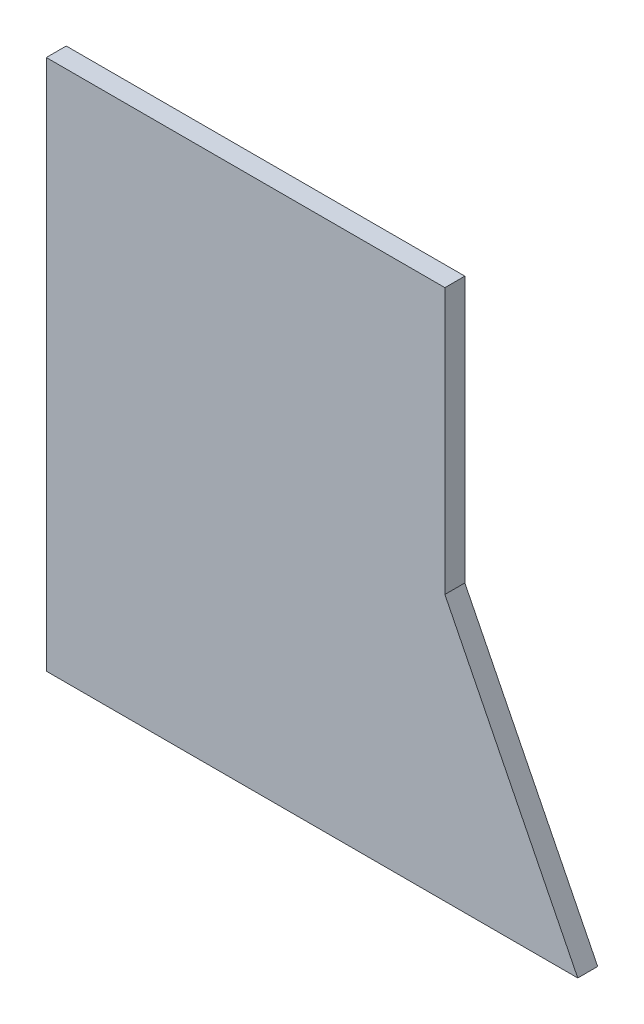
ISO-10303-21;
HEADER;
FILE_DESCRIPTION(('STEP AP214'),'2;1');
FILE_NAME('part.step','',(''),(''),'','','');
FILE_SCHEMA(('AUTOMOTIVE_DESIGN { 1 0 10303 214 1 1 1 1 }'));
ENDSEC;
DATA;
#1=APPLICATION_CONTEXT('core data for automotive mechanical design processes');
#2=APPLICATION_PROTOCOL_DEFINITION('international standard','automotive_design',2000,#1);
#3=PRODUCT_CONTEXT('',#1,'mechanical');
#4=PRODUCT('Part','Part','',(#3));
#5=PRODUCT_RELATED_PRODUCT_CATEGORY('part','',(#4));
#6=PRODUCT_DEFINITION_FORMATION('','',#4);
#7=PRODUCT_DEFINITION_CONTEXT('part definition',#1,'design');
#8=PRODUCT_DEFINITION('design','',#6,#7);
#9=PRODUCT_DEFINITION_SHAPE('','',#8);
#10=(LENGTH_UNIT() NAMED_UNIT(*) SI_UNIT(.MILLI.,.METRE.));
#11=(NAMED_UNIT(*) PLANE_ANGLE_UNIT() SI_UNIT($,.RADIAN.));
#12=(NAMED_UNIT(*) SI_UNIT($,.STERADIAN.) SOLID_ANGLE_UNIT());
#13=UNCERTAINTY_MEASURE_WITH_UNIT(LENGTH_MEASURE(1.E-05),#10,'distance_accuracy_value','');
#14=(GEOMETRIC_REPRESENTATION_CONTEXT(3) GLOBAL_UNCERTAINTY_ASSIGNED_CONTEXT((#13)) GLOBAL_UNIT_ASSIGNED_CONTEXT((#10,
#11,#12)) REPRESENTATION_CONTEXT('',''));
#15=CARTESIAN_POINT('',(0.,0.,0.));
#16=DIRECTION('',(0.,0.,1.));
#17=DIRECTION('',(1.,0.,0.));
#18=AXIS2_PLACEMENT_3D('',#15,#16,#17);
#19=CARTESIAN_POINT('',(0.3,0.,0.015));
#20=DIRECTION('',(-0.894427190999916,-0.447213595499958,0.));
#21=DIRECTION('',(0.447213595499958,-0.894427190999916,0.));
#22=AXIS2_PLACEMENT_3D('',#19,#20,#21);
#23=PLANE('',#22);
#24=DIRECTION('',(-0.447213595499958,0.894427190999916,0.));
#25=VECTOR('',#24,1.);
#26=CARTESIAN_POINT('',(0.3,0.,-0.015));
#27=LINE('',#26,#25);
#28=CARTESIAN_POINT('',(0.5,-0.4,-0.015));
#29=VERTEX_POINT('',#28);
#30=CARTESIAN_POINT('',(0.3,0.,-0.015));
#31=VERTEX_POINT('',#30);
#32=EDGE_CURVE('E111',#29,#31,#27,.T.);
#33=ORIENTED_EDGE('',*,*,#32,.T.);
#34=DIRECTION('',(0.,0.,-1.));
#35=VECTOR('',#34,1.);
#36=CARTESIAN_POINT('',(0.3,0.,0.015));
#37=LINE('',#36,#35);
#38=CARTESIAN_POINT('',(0.3,0.,0.015));
#39=VERTEX_POINT('',#38);
#40=EDGE_CURVE('E41',#39,#31,#37,.T.);
#41=ORIENTED_EDGE('',*,*,#40,.F.);
#42=DIRECTION('',(-0.447213595499958,0.894427190999916,0.));
#43=VECTOR('',#42,1.);
#44=CARTESIAN_POINT('',(0.3,0.,0.015));
#45=LINE('',#44,#43);
#46=CARTESIAN_POINT('',(0.5,-0.4,0.015));
#47=VERTEX_POINT('',#46);
#48=EDGE_CURVE('E84',#47,#39,#45,.T.);
#49=ORIENTED_EDGE('',*,*,#48,.F.);
#50=DIRECTION('',(0.,0.,-1.));
#51=VECTOR('',#50,1.);
#52=CARTESIAN_POINT('',(0.5,-0.4,0.015));
#53=LINE('',#52,#51);
#54=EDGE_CURVE('E11',#47,#29,#53,.T.);
#55=ORIENTED_EDGE('',*,*,#54,.T.);
#56=EDGE_LOOP('',(#33,#41,#49,#55));
#57=FACE_BOUND('',#56,.T.);
#58=ADVANCED_FACE('F33',(#57),#23,.F.);
#59=CARTESIAN_POINT('',(0.3,0.4,0.015));
#60=DIRECTION('',(-1.,0.,0.));
#61=DIRECTION('',(0.,-1.,0.));
#62=AXIS2_PLACEMENT_3D('',#59,#60,#61);
#63=PLANE('',#62);
#64=DIRECTION('',(0.,1.,0.));
#65=VECTOR('',#64,1.);
#66=CARTESIAN_POINT('',(0.3,0.4,-0.015));
#67=LINE('',#66,#65);
#68=CARTESIAN_POINT('',(0.3,0.4,-0.015));
#69=VERTEX_POINT('',#68);
#70=EDGE_CURVE('E100',#31,#69,#67,.T.);
#71=ORIENTED_EDGE('',*,*,#70,.T.);
#72=DIRECTION('',(0.,0.,-1.));
#73=VECTOR('',#72,1.);
#74=CARTESIAN_POINT('',(0.3,0.4,0.015));
#75=LINE('',#74,#73);
#76=CARTESIAN_POINT('',(0.3,0.4,0.015));
#77=VERTEX_POINT('',#76);
#78=EDGE_CURVE('E97',#77,#69,#75,.T.);
#79=ORIENTED_EDGE('',*,*,#78,.F.);
#80=DIRECTION('',(0.,1.,0.));
#81=VECTOR('',#80,1.);
#82=CARTESIAN_POINT('',(0.3,0.4,0.015));
#83=LINE('',#82,#81);
#84=EDGE_CURVE('E89',#39,#77,#83,.T.);
#85=ORIENTED_EDGE('',*,*,#84,.F.);
#86=ORIENTED_EDGE('',*,*,#40,.T.);
#87=EDGE_LOOP('',(#71,#79,#85,#86));
#88=FACE_BOUND('',#87,.T.);
#89=ADVANCED_FACE('F98',(#88),#63,.F.);
#90=CARTESIAN_POINT('',(-0.3,0.4,0.015));
#91=DIRECTION('',(0.,-1.,0.));
#92=DIRECTION('',(0.,0.,-1.));
#93=AXIS2_PLACEMENT_3D('',#90,#91,#92);
#94=PLANE('',#93);
#95=DIRECTION('',(-1.,0.,0.));
#96=VECTOR('',#95,1.);
#97=CARTESIAN_POINT('',(-0.3,0.4,-0.015));
#98=LINE('',#97,#96);
#99=CARTESIAN_POINT('',(-0.3,0.4,-0.015));
#100=VERTEX_POINT('',#99);
#101=EDGE_CURVE('E70',#69,#100,#98,.T.);
#102=ORIENTED_EDGE('',*,*,#101,.T.);
#103=DIRECTION('',(0.,0.,-1.));
#104=VECTOR('',#103,1.);
#105=CARTESIAN_POINT('',(-0.3,0.4,0.015));
#106=LINE('',#105,#104);
#107=CARTESIAN_POINT('',(-0.3,0.4,0.015));
#108=VERTEX_POINT('',#107);
#109=EDGE_CURVE('E101',#108,#100,#106,.T.);
#110=ORIENTED_EDGE('',*,*,#109,.F.);
#111=DIRECTION('',(-1.,0.,0.));
#112=VECTOR('',#111,1.);
#113=CARTESIAN_POINT('',(-0.3,0.4,0.015));
#114=LINE('',#113,#112);
#115=EDGE_CURVE('E93',#77,#108,#114,.T.);
#116=ORIENTED_EDGE('',*,*,#115,.F.);
#117=ORIENTED_EDGE('',*,*,#78,.T.);
#118=EDGE_LOOP('',(#102,#110,#116,#117));
#119=FACE_BOUND('',#118,.T.);
#120=ADVANCED_FACE('F103',(#119),#94,.F.);
#121=CARTESIAN_POINT('',(-0.3,0.4,0.015));
#122=DIRECTION('',(1.,0.,0.));
#123=DIRECTION('',(0.,1.,0.));
#124=AXIS2_PLACEMENT_3D('',#121,#122,#123);
#125=PLANE('',#124);
#126=DIRECTION('',(0.,-1.,0.));
#127=VECTOR('',#126,1.);
#128=CARTESIAN_POINT('',(-0.3,0.4,-0.015));
#129=LINE('',#128,#127);
#130=CARTESIAN_POINT('',(-0.3,-0.4,-0.015));
#131=VERTEX_POINT('',#130);
#132=EDGE_CURVE('E77',#100,#131,#129,.T.);
#133=ORIENTED_EDGE('',*,*,#132,.T.);
#134=DIRECTION('',(0.,0.,-1.));
#135=VECTOR('',#134,1.);
#136=CARTESIAN_POINT('',(-0.3,-0.4,0.015));
#137=LINE('',#136,#135);
#138=CARTESIAN_POINT('',(-0.3,-0.4,0.015));
#139=VERTEX_POINT('',#138);
#140=EDGE_CURVE('E107',#139,#131,#137,.T.);
#141=ORIENTED_EDGE('',*,*,#140,.F.);
#142=DIRECTION('',(0.,-1.,0.));
#143=VECTOR('',#142,1.);
#144=CARTESIAN_POINT('',(-0.3,0.4,0.015));
#145=LINE('',#144,#143);
#146=EDGE_CURVE('E105',#108,#139,#145,.T.);
#147=ORIENTED_EDGE('',*,*,#146,.F.);
#148=ORIENTED_EDGE('',*,*,#109,.T.);
#149=EDGE_LOOP('',(#133,#141,#147,#148));
#150=FACE_BOUND('',#149,.T.);
#151=ADVANCED_FACE('F124',(#150),#125,.F.);
#152=CARTESIAN_POINT('',(-0.3,-0.4,0.015));
#153=DIRECTION('',(0.,1.,0.));
#154=DIRECTION('',(0.,0.,1.));
#155=AXIS2_PLACEMENT_3D('',#152,#153,#154);
#156=PLANE('',#155);
#157=DIRECTION('',(1.,0.,0.));
#158=VECTOR('',#157,1.);
#159=CARTESIAN_POINT('',(-0.3,-0.4,-0.015));
#160=LINE('',#159,#158);
#161=EDGE_CURVE('E116',#131,#29,#160,.T.);
#162=ORIENTED_EDGE('',*,*,#161,.T.);
#163=ORIENTED_EDGE('',*,*,#54,.F.);
#164=DIRECTION('',(1.,0.,0.));
#165=VECTOR('',#164,1.);
#166=CARTESIAN_POINT('',(0.5,-0.4,0.015));
#167=LINE('',#166,#165);
#168=EDGE_CURVE('E49',#139,#47,#167,.T.);
#169=ORIENTED_EDGE('',*,*,#168,.F.);
#170=ORIENTED_EDGE('',*,*,#140,.T.);
#171=EDGE_LOOP('',(#162,#163,#169,#170));
#172=FACE_BOUND('',#171,.T.);
#173=ADVANCED_FACE('F123',(#172),#156,.F.);
#174=CARTESIAN_POINT('',(0.,0.,0.015));
#175=DIRECTION('',(0.,0.,1.));
#176=DIRECTION('',(1.,0.,0.));
#177=AXIS2_PLACEMENT_3D('',#174,#175,#176);
#178=PLANE('',#177);
#179=ORIENTED_EDGE('',*,*,#168,.T.);
#180=ORIENTED_EDGE('',*,*,#48,.T.);
#181=ORIENTED_EDGE('',*,*,#84,.T.);
#182=ORIENTED_EDGE('',*,*,#115,.T.);
#183=ORIENTED_EDGE('',*,*,#146,.T.);
#184=EDGE_LOOP('',(#179,#180,#181,#182,#183));
#185=FACE_BOUND('',#184,.T.);
#186=ADVANCED_FACE('F91',(#185),#178,.T.);
#187=CARTESIAN_POINT('',(0.,0.,-0.015));
#188=DIRECTION('',(0.,0.,1.));
#189=DIRECTION('',(1.,0.,0.));
#190=AXIS2_PLACEMENT_3D('',#187,#188,#189);
#191=PLANE('',#190);
#192=ORIENTED_EDGE('',*,*,#32,.F.);
#193=ORIENTED_EDGE('',*,*,#161,.F.);
#194=ORIENTED_EDGE('',*,*,#132,.F.);
#195=ORIENTED_EDGE('',*,*,#101,.F.);
#196=ORIENTED_EDGE('',*,*,#70,.F.);
#197=EDGE_LOOP('',(#192,#193,#194,#195,#196));
#198=FACE_BOUND('',#197,.T.);
#199=ADVANCED_FACE('F121',(#198),#191,.F.);
#200=CLOSED_SHELL('',(#58,#89,#120,#151,#173,#186,#199));
#201=MANIFOLD_SOLID_BREP('B2',#200);
#202=ADVANCED_BREP_SHAPE_REPRESENTATION('',(#18,#201),#14);
#203=SHAPE_DEFINITION_REPRESENTATION(#9,#202);
ENDSEC;
END-ISO-10303-21;
